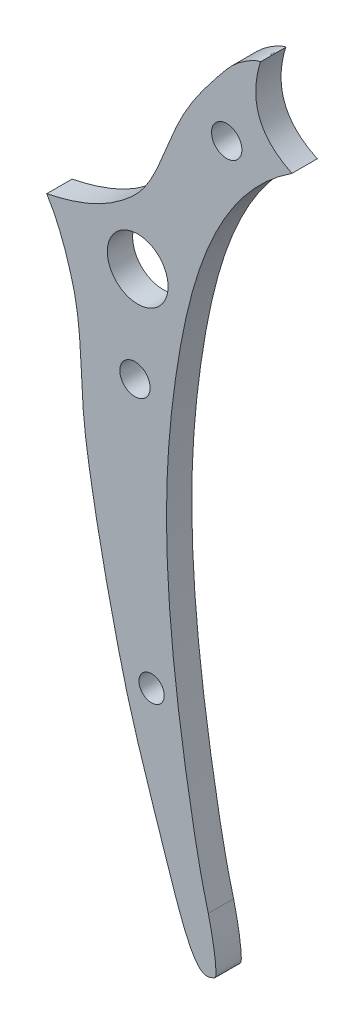
ISO-10303-21;
HEADER;
FILE_DESCRIPTION(('STEP AP214'),'2;1');
FILE_NAME('part.step','',(''),(''),'','','');
FILE_SCHEMA(('AUTOMOTIVE_DESIGN { 1 0 10303 214 1 1 1 1 }'));
ENDSEC;
DATA;
#1=APPLICATION_CONTEXT('core data for automotive mechanical design processes');
#2=APPLICATION_PROTOCOL_DEFINITION('international standard','automotive_design',2000,#1);
#3=PRODUCT_CONTEXT('',#1,'mechanical');
#4=PRODUCT('Part','Part','',(#3));
#5=PRODUCT_RELATED_PRODUCT_CATEGORY('part','',(#4));
#6=PRODUCT_DEFINITION_FORMATION('','',#4);
#7=PRODUCT_DEFINITION_CONTEXT('part definition',#1,'design');
#8=PRODUCT_DEFINITION('design','',#6,#7);
#9=PRODUCT_DEFINITION_SHAPE('','',#8);
#10=(LENGTH_UNIT() NAMED_UNIT(*) SI_UNIT(.MILLI.,.METRE.));
#11=(NAMED_UNIT(*) PLANE_ANGLE_UNIT() SI_UNIT($,.RADIAN.));
#12=(NAMED_UNIT(*) SI_UNIT($,.STERADIAN.) SOLID_ANGLE_UNIT());
#13=UNCERTAINTY_MEASURE_WITH_UNIT(LENGTH_MEASURE(1.E-05),#10,'distance_accuracy_value','');
#14=(GEOMETRIC_REPRESENTATION_CONTEXT(3) GLOBAL_UNCERTAINTY_ASSIGNED_CONTEXT((#13)) GLOBAL_UNIT_ASSIGNED_CONTEXT((#10,
#11,#12)) REPRESENTATION_CONTEXT('',''));
#15=CARTESIAN_POINT('',(0.,0.,0.));
#16=DIRECTION('',(0.,0.,1.));
#17=DIRECTION('',(1.,0.,0.));
#18=AXIS2_PLACEMENT_3D('',#15,#16,#17);
#19=CARTESIAN_POINT('',(-87.1861843515802,115.027901143904,25.));
#20=CARTESIAN_POINT('',(-76.5425272644531,98.2816896170803,25.));
#21=CARTESIAN_POINT('',(-67.4878712596053,73.4004376049712,25.));
#22=CARTESIAN_POINT('',(-52.0889897225085,17.039725060242,25.));
#23=CARTESIAN_POINT('',(-54.2193546727566,-35.9923177249694,25.));
#24=CARTESIAN_POINT('',(-41.4171310062278,-126.676087435173,25.));
#25=CARTESIAN_POINT('',(-11.075617495965,-267.508782170406,25.));
#26=CARTESIAN_POINT('',(3.32002903485526,-312.5761864347,25.));
#27=CARTESIAN_POINT('',(60.0248739983986,-482.338487703926,25.));
#28=CARTESIAN_POINT('',(72.1571609309396,-475.401329807566,25.));
#29=CARTESIAN_POINT('',(81.9097550722447,-471.892242374189,25.));
#30=CARTESIAN_POINT('',(77.4792085720168,-441.488096787512,25.));
#31=CARTESIAN_POINT('',(72.4497728717402,-420.811527797486,25.));
#32=B_SPLINE_CURVE_WITH_KNOTS('',3,(#19,#20,#21,#22,#23,#24,#25,#26,#27,#28,#29,#30,#31),
.UNSPECIFIED.,.F.,.F.,(4,1,1,1,1,1,1,1,1,1,4),(0.,0.0799305481367634,0.106477312801998,
0.247802054002309,0.285951548073293,0.470306660861802,0.743153279634555,0.791096182257853,
0.932109075446237,0.954762118385306,1.),.UNSPECIFIED.);
#33=DIRECTION('',(0.,0.,-1.));
#34=VECTOR('',#33,1.);
#35=SURFACE_OF_LINEAR_EXTRUSION('',#32,#34);
#36=CARTESIAN_POINT('',(-87.1861843515802,115.027901143904,0.));
#37=CARTESIAN_POINT('',(-76.5425272644531,98.2816896170803,0.));
#38=CARTESIAN_POINT('',(-67.4878712596053,73.4004376049712,0.));
#39=CARTESIAN_POINT('',(-52.0889897225085,17.039725060242,0.));
#40=CARTESIAN_POINT('',(-54.2193546727566,-35.9923177249694,0.));
#41=CARTESIAN_POINT('',(-41.4171310062278,-126.676087435173,0.));
#42=CARTESIAN_POINT('',(-11.075617495965,-267.508782170406,0.));
#43=CARTESIAN_POINT('',(3.32002903485526,-312.5761864347,0.));
#44=CARTESIAN_POINT('',(60.0248739983986,-482.338487703926,0.));
#45=CARTESIAN_POINT('',(72.1571609309396,-475.401329807566,0.));
#46=CARTESIAN_POINT('',(81.9097550722447,-471.892242374189,0.));
#47=CARTESIAN_POINT('',(77.4792085720168,-441.488096787512,0.));
#48=CARTESIAN_POINT('',(72.4497728717402,-420.811527797486,0.));
#49=B_SPLINE_CURVE_WITH_KNOTS('',3,(#36,#37,#38,#39,#40,#41,#42,#43,#44,#45,#46,#47,#48),
.UNSPECIFIED.,.F.,.F.,(4,1,1,1,1,1,1,1,1,1,4),(0.,0.0799305481367634,0.106477312801998,
0.247802054002309,0.285951548073293,0.470306660861802,0.743153279634555,0.791096182257853,
0.932109075446237,0.954762118385306,1.),.UNSPECIFIED.);
#50=CARTESIAN_POINT('',(-87.1861843515805,115.027901143904,0.));
#51=VERTEX_POINT('',#50);
#52=CARTESIAN_POINT('',(72.4497728717403,-420.811527797486,0.));
#53=VERTEX_POINT('',#52);
#54=EDGE_CURVE('E163',#51,#53,#49,.T.);
#55=ORIENTED_EDGE('',*,*,#54,.T.);
#56=DIRECTION('',(0.,0.,-1.));
#57=VECTOR('',#56,1.);
#58=CARTESIAN_POINT('',(72.4497728717403,-420.811527797486,25.));
#59=LINE('',#58,#57);
#60=CARTESIAN_POINT('',(72.4497728717403,-420.811527797486,25.));
#61=VERTEX_POINT('',#60);
#62=EDGE_CURVE('E11',#61,#53,#59,.T.);
#63=ORIENTED_EDGE('',*,*,#62,.F.);
#64=CARTESIAN_POINT('',(-87.1861843515805,115.027901143904,25.));
#65=VERTEX_POINT('',#64);
#66=EDGE_CURVE('E91',#65,#61,#32,.T.);
#67=ORIENTED_EDGE('',*,*,#66,.F.);
#68=DIRECTION('',(0.,0.,-1.));
#69=VECTOR('',#68,1.);
#70=CARTESIAN_POINT('',(-87.1861843515805,115.027901143904,25.));
#71=LINE('',#70,#69);
#72=EDGE_CURVE('E162',#65,#51,#71,.T.);
#73=ORIENTED_EDGE('',*,*,#72,.T.);
#74=EDGE_LOOP('',(#55,#63,#67,#73));
#75=FACE_BOUND('',#74,.T.);
#76=ADVANCED_FACE('F47',(#75),#35,.F.);
#77=CARTESIAN_POINT('',(155.117180067871,253.566910875198,25.));
#78=CARTESIAN_POINT('',(80.9612886685316,205.050155561332,25.));
#79=CARTESIAN_POINT('',(44.4458758712285,80.1171696910479,25.));
#80=CARTESIAN_POINT('',(23.7401890727471,-128.723756165747,25.));
#81=CARTESIAN_POINT('',(44.7011588682529,-287.641647918392,25.));
#82=CARTESIAN_POINT('',(65.3097013325224,-394.10237129893,25.));
#83=CARTESIAN_POINT('',(72.4497728717403,-420.811527797486,25.));
#84=B_SPLINE_CURVE_WITH_KNOTS('',3,(#77,#78,#79,#80,#81,#82,#83),.UNSPECIFIED.,.F.,.F.,(4,1,1,1,
4),(0.,0.356858306110987,0.509383165279524,0.894986658962069,1.),.UNSPECIFIED.);
#85=DIRECTION('',(0.,0.,-1.));
#86=VECTOR('',#85,1.);
#87=SURFACE_OF_LINEAR_EXTRUSION('',#84,#86);
#88=CARTESIAN_POINT('',(155.117180067871,253.566910875198,0.));
#89=CARTESIAN_POINT('',(80.9612886685316,205.050155561332,0.));
#90=CARTESIAN_POINT('',(44.4458758712285,80.1171696910479,0.));
#91=CARTESIAN_POINT('',(23.7401890727471,-128.723756165747,0.));
#92=CARTESIAN_POINT('',(44.7011588682529,-287.641647918392,0.));
#93=CARTESIAN_POINT('',(65.3097013325224,-394.10237129893,0.));
#94=CARTESIAN_POINT('',(72.4497728717403,-420.811527797486,0.));
#95=B_SPLINE_CURVE_WITH_KNOTS('',3,(#88,#89,#90,#91,#92,#93,#94),.UNSPECIFIED.,.F.,.F.,(4,1,1,1,
4),(0.,0.356858306110987,0.509383165279524,0.894986658962069,1.),.UNSPECIFIED.);
#96=CARTESIAN_POINT('',(155.117180067871,253.566910875198,0.));
#97=VERTEX_POINT('',#96);
#98=EDGE_CURVE('E101',#97,#53,#95,.T.);
#99=ORIENTED_EDGE('',*,*,#98,.F.);
#100=DIRECTION('',(0.,0.,-1.));
#101=VECTOR('',#100,1.);
#102=CARTESIAN_POINT('',(155.117180067871,253.566910875198,25.));
#103=LINE('',#102,#101);
#104=CARTESIAN_POINT('',(155.117180067871,253.566910875198,25.));
#105=VERTEX_POINT('',#104);
#106=EDGE_CURVE('E57',#105,#97,#103,.T.);
#107=ORIENTED_EDGE('',*,*,#106,.F.);
#108=EDGE_CURVE('E99',#105,#61,#84,.T.);
#109=ORIENTED_EDGE('',*,*,#108,.T.);
#110=ORIENTED_EDGE('',*,*,#62,.T.);
#111=EDGE_LOOP('',(#99,#107,#109,#110));
#112=FACE_BOUND('',#111,.T.);
#113=ADVANCED_FACE('F98',(#112),#87,.T.);
#114=CARTESIAN_POINT('',(155.117180067871,253.566910875198,25.));
#115=CARTESIAN_POINT('',(106.393272385494,276.590125095207,25.));
#116=CARTESIAN_POINT('',(123.991455877653,333.411826796243,25.));
#117=B_SPLINE_CURVE_WITH_KNOTS('',2,(#114,#115,#116),.UNSPECIFIED.,.F.,.F.,(3,3),(0.,1.),.UNSPECIFIED.);
#118=DIRECTION('',(0.,0.,-1.));
#119=VECTOR('',#118,1.);
#120=SURFACE_OF_LINEAR_EXTRUSION('',#117,#119);
#121=CARTESIAN_POINT('',(155.117180067871,253.566910875198,0.));
#122=CARTESIAN_POINT('',(106.393272385494,276.590125095207,0.));
#123=CARTESIAN_POINT('',(123.991455877653,333.411826796243,0.));
#124=B_SPLINE_CURVE_WITH_KNOTS('',2,(#121,#122,#123),.UNSPECIFIED.,.F.,.F.,(3,3),(0.,1.),.UNSPECIFIED.);
#125=CARTESIAN_POINT('',(123.991455877653,333.411826796243,0.));
#126=VERTEX_POINT('',#125);
#127=EDGE_CURVE('E80',#97,#126,#124,.T.);
#128=ORIENTED_EDGE('',*,*,#127,.T.);
#129=DIRECTION('',(0.,0.,-1.));
#130=VECTOR('',#129,1.);
#131=CARTESIAN_POINT('',(123.991455877653,333.411826796243,25.));
#132=LINE('',#131,#130);
#133=CARTESIAN_POINT('',(123.991455877653,333.411826796243,25.));
#134=VERTEX_POINT('',#133);
#135=EDGE_CURVE('E103',#134,#126,#132,.T.);
#136=ORIENTED_EDGE('',*,*,#135,.F.);
#137=EDGE_CURVE('E104',#105,#134,#117,.T.);
#138=ORIENTED_EDGE('',*,*,#137,.F.);
#139=ORIENTED_EDGE('',*,*,#106,.T.);
#140=EDGE_LOOP('',(#128,#136,#138,#139));
#141=FACE_BOUND('',#140,.T.);
#142=ADVANCED_FACE('F105',(#141),#120,.F.);
#143=CARTESIAN_POINT('',(2.70839091096043,95.5203556953334,25.));
#144=DIRECTION('',(0.,0.,-1.));
#145=DIRECTION('',(-1.,0.,0.));
#146=AXIS2_PLACEMENT_3D('',#143,#144,#145);
#147=CYLINDRICAL_SURFACE('',#146,30.);
#148=CARTESIAN_POINT('',(2.70839091096043,95.5203556953334,25.));
#149=DIRECTION('',(0.,0.,1.));
#150=DIRECTION('',(1.,0.,0.));
#151=AXIS2_PLACEMENT_3D('',#148,#149,#150);
#152=CIRCLE('',#151,30.);
#153=CARTESIAN_POINT('',(32.7083909109604,95.5203556953334,25.));
#154=VERTEX_POINT('',#153);
#155=EDGE_CURVE('E154',#154,#154,#152,.T.);
#156=ORIENTED_EDGE('',*,*,#155,.T.);
#157=EDGE_LOOP('',(#156));
#158=FACE_BOUND('',#157,.T.);
#159=CARTESIAN_POINT('',(2.70839091096043,95.5203556953334,0.));
#160=DIRECTION('',(0.,0.,1.));
#161=DIRECTION('',(1.,0.,0.));
#162=AXIS2_PLACEMENT_3D('',#159,#160,#161);
#163=CIRCLE('',#162,30.);
#164=CARTESIAN_POINT('',(32.7083909109604,95.5203556953334,0.));
#165=VERTEX_POINT('',#164);
#166=EDGE_CURVE('E201',#165,#165,#163,.T.);
#167=ORIENTED_EDGE('',*,*,#166,.F.);
#168=EDGE_LOOP('',(#167));
#169=FACE_BOUND('',#168,.T.);
#170=ADVANCED_FACE('F131',(#158,#169),#147,.F.);
#171=CARTESIAN_POINT('',(90.6353379813006,249.018544508266,25.));
#172=DIRECTION('',(0.,0.,-1.));
#173=DIRECTION('',(-1.,0.,0.));
#174=AXIS2_PLACEMENT_3D('',#171,#172,#173);
#175=CYLINDRICAL_SURFACE('',#174,15.);
#176=CARTESIAN_POINT('',(90.6353379813006,249.018544508266,25.));
#177=DIRECTION('',(0.,0.,1.));
#178=DIRECTION('',(1.,0.,0.));
#179=AXIS2_PLACEMENT_3D('',#176,#177,#178);
#180=CIRCLE('',#179,15.);
#181=CARTESIAN_POINT('',(105.635337981301,249.018544508266,25.));
#182=VERTEX_POINT('',#181);
#183=EDGE_CURVE('E150',#182,#182,#180,.T.);
#184=ORIENTED_EDGE('',*,*,#183,.T.);
#185=EDGE_LOOP('',(#184));
#186=FACE_BOUND('',#185,.T.);
#187=CARTESIAN_POINT('',(90.6353379813006,249.018544508266,0.));
#188=DIRECTION('',(0.,0.,1.));
#189=DIRECTION('',(1.,0.,0.));
#190=AXIS2_PLACEMENT_3D('',#187,#188,#189);
#191=CIRCLE('',#190,15.);
#192=CARTESIAN_POINT('',(105.635337981301,249.018544508266,0.));
#193=VERTEX_POINT('',#192);
#194=EDGE_CURVE('E197',#193,#193,#191,.T.);
#195=ORIENTED_EDGE('',*,*,#194,.F.);
#196=EDGE_LOOP('',(#195));
#197=FACE_BOUND('',#196,.T.);
#198=ADVANCED_FACE('F236',(#186,#197),#175,.F.);
#199=CARTESIAN_POINT('',(16.4286998587459,-256.271030273807,25.));
#200=DIRECTION('',(0.,0.,-1.));
#201=DIRECTION('',(-1.,0.,0.));
#202=AXIS2_PLACEMENT_3D('',#199,#200,#201);
#203=CYLINDRICAL_SURFACE('',#202,12.5);
#204=CARTESIAN_POINT('',(16.4286998587459,-256.271030273807,25.));
#205=DIRECTION('',(0.,0.,1.));
#206=DIRECTION('',(1.,0.,0.));
#207=AXIS2_PLACEMENT_3D('',#204,#205,#206);
#208=CIRCLE('',#207,12.5);
#209=CARTESIAN_POINT('',(28.9286998587459,-256.271030273807,25.));
#210=VERTEX_POINT('',#209);
#211=EDGE_CURVE('E143',#210,#210,#208,.T.);
#212=ORIENTED_EDGE('',*,*,#211,.T.);
#213=EDGE_LOOP('',(#212));
#214=FACE_BOUND('',#213,.T.);
#215=CARTESIAN_POINT('',(16.4286998587459,-256.271030273807,0.));
#216=DIRECTION('',(0.,0.,1.));
#217=DIRECTION('',(1.,0.,0.));
#218=AXIS2_PLACEMENT_3D('',#215,#216,#217);
#219=CIRCLE('',#218,12.5);
#220=CARTESIAN_POINT('',(28.9286998587459,-256.271030273807,0.));
#221=VERTEX_POINT('',#220);
#222=EDGE_CURVE('E190',#221,#221,#219,.T.);
#223=ORIENTED_EDGE('',*,*,#222,.F.);
#224=EDGE_LOOP('',(#223));
#225=FACE_BOUND('',#224,.T.);
#226=ADVANCED_FACE('F136',(#214,#225),#203,.F.);
#227=CARTESIAN_POINT('',(123.991455877653,333.411826796243,25.));
#228=CARTESIAN_POINT('',(121.940962732917,333.924631611575,25.));
#229=CARTESIAN_POINT('',(103.126737259353,325.594457240455,25.));
#230=CARTESIAN_POINT('',(76.8434099424331,293.735407356811,25.));
#231=CARTESIAN_POINT('',(36.561568956429,242.824472462812,25.));
#232=CARTESIAN_POINT('',(21.3704410548067,176.135728768921,25.));
#233=CARTESIAN_POINT('',(-25.7972450538794,134.360058233217,25.));
#234=CARTESIAN_POINT('',(-52.7841078448604,122.398568008737,25.));
#235=CARTESIAN_POINT('',(-87.1861843515805,115.027901143904,25.));
#236=B_SPLINE_CURVE_WITH_KNOTS('',3,(#227,#228,#229,#230,#231,#232,#233,#234,#235),
.UNSPECIFIED.,.F.,.F.,(4,1,1,1,1,1,4),(0.,0.175010548646843,0.215542487207237,0.40531938560394,
0.676608920644849,0.736076982084455,1.),.UNSPECIFIED.);
#237=DIRECTION('',(0.,0.,-1.));
#238=VECTOR('',#237,1.);
#239=SURFACE_OF_LINEAR_EXTRUSION('',#236,#238);
#240=CARTESIAN_POINT('',(123.991455877653,333.411826796243,0.));
#241=CARTESIAN_POINT('',(121.940962732917,333.924631611575,0.));
#242=CARTESIAN_POINT('',(103.126737259353,325.594457240455,0.));
#243=CARTESIAN_POINT('',(76.8434099424331,293.735407356811,0.));
#244=CARTESIAN_POINT('',(36.561568956429,242.824472462812,0.));
#245=CARTESIAN_POINT('',(21.3704410548067,176.135728768921,0.));
#246=CARTESIAN_POINT('',(-25.7972450538794,134.360058233217,0.));
#247=CARTESIAN_POINT('',(-52.7841078448604,122.398568008737,0.));
#248=CARTESIAN_POINT('',(-87.1861843515805,115.027901143904,0.));
#249=B_SPLINE_CURVE_WITH_KNOTS('',3,(#240,#241,#242,#243,#244,#245,#246,#247,#248),
.UNSPECIFIED.,.F.,.F.,(4,1,1,1,1,1,4),(0.,0.175010548646843,0.215542487207237,0.40531938560394,
0.676608920644849,0.736076982084455,1.),.UNSPECIFIED.);
#250=EDGE_CURVE('E86',#126,#51,#249,.T.);
#251=ORIENTED_EDGE('',*,*,#250,.T.);
#252=ORIENTED_EDGE('',*,*,#72,.F.);
#253=EDGE_CURVE('E65',#134,#65,#236,.T.);
#254=ORIENTED_EDGE('',*,*,#253,.F.);
#255=ORIENTED_EDGE('',*,*,#135,.T.);
#256=EDGE_LOOP('',(#251,#252,#254,#255));
#257=FACE_BOUND('',#256,.T.);
#258=ADVANCED_FACE('F132',(#257),#239,.F.);
#259=CARTESIAN_POINT('',(0.,0.,25.));
#260=DIRECTION('',(0.,0.,-1.));
#261=DIRECTION('',(-1.,0.,0.));
#262=AXIS2_PLACEMENT_3D('',#259,#260,#261);
#263=CYLINDRICAL_SURFACE('',#262,15.);
#264=CARTESIAN_POINT('',(0.,0.,25.));
#265=DIRECTION('',(0.,0.,1.));
#266=DIRECTION('',(1.,0.,0.));
#267=AXIS2_PLACEMENT_3D('',#264,#265,#266);
#268=CIRCLE('',#267,15.);
#269=CARTESIAN_POINT('',(15.,0.,25.));
#270=VERTEX_POINT('',#269);
#271=EDGE_CURVE('E158',#270,#270,#268,.T.);
#272=ORIENTED_EDGE('',*,*,#271,.T.);
#273=EDGE_LOOP('',(#272));
#274=FACE_BOUND('',#273,.T.);
#275=CARTESIAN_POINT('',(0.,0.,0.));
#276=DIRECTION('',(0.,0.,1.));
#277=DIRECTION('',(1.,0.,0.));
#278=AXIS2_PLACEMENT_3D('',#275,#276,#277);
#279=CIRCLE('',#278,15.);
#280=CARTESIAN_POINT('',(15.,0.,0.));
#281=VERTEX_POINT('',#280);
#282=EDGE_CURVE('E113',#281,#281,#279,.T.);
#283=ORIENTED_EDGE('',*,*,#282,.F.);
#284=EDGE_LOOP('',(#283));
#285=FACE_BOUND('',#284,.T.);
#286=ADVANCED_FACE('F135',(#274,#285),#263,.F.);
#287=CARTESIAN_POINT('',(0.,0.,25.));
#288=DIRECTION('',(0.,0.,1.));
#289=DIRECTION('',(1.,0.,0.));
#290=AXIS2_PLACEMENT_3D('',#287,#288,#289);
#291=PLANE('',#290);
#292=ORIENTED_EDGE('',*,*,#66,.T.);
#293=ORIENTED_EDGE('',*,*,#108,.F.);
#294=ORIENTED_EDGE('',*,*,#137,.T.);
#295=ORIENTED_EDGE('',*,*,#253,.T.);
#296=EDGE_LOOP('',(#292,#293,#294,#295));
#297=FACE_BOUND('',#296,.T.);
#298=ORIENTED_EDGE('',*,*,#211,.F.);
#299=EDGE_LOOP('',(#298));
#300=FACE_BOUND('',#299,.T.);
#301=ORIENTED_EDGE('',*,*,#183,.F.);
#302=EDGE_LOOP('',(#301));
#303=FACE_BOUND('',#302,.T.);
#304=ORIENTED_EDGE('',*,*,#155,.F.);
#305=EDGE_LOOP('',(#304));
#306=FACE_BOUND('',#305,.T.);
#307=ORIENTED_EDGE('',*,*,#271,.F.);
#308=EDGE_LOOP('',(#307));
#309=FACE_BOUND('',#308,.T.);
#310=ADVANCED_FACE('F108',(#297,#300,#303,#306,#309),#291,.T.);
#311=CARTESIAN_POINT('',(0.,0.,0.));
#312=DIRECTION('',(0.,0.,1.));
#313=DIRECTION('',(1.,0.,0.));
#314=AXIS2_PLACEMENT_3D('',#311,#312,#313);
#315=PLANE('',#314);
#316=ORIENTED_EDGE('',*,*,#54,.F.);
#317=ORIENTED_EDGE('',*,*,#250,.F.);
#318=ORIENTED_EDGE('',*,*,#127,.F.);
#319=ORIENTED_EDGE('',*,*,#98,.T.);
#320=EDGE_LOOP('',(#316,#317,#318,#319));
#321=FACE_BOUND('',#320,.T.);
#322=ORIENTED_EDGE('',*,*,#222,.T.);
#323=EDGE_LOOP('',(#322));
#324=FACE_BOUND('',#323,.T.);
#325=ORIENTED_EDGE('',*,*,#194,.T.);
#326=EDGE_LOOP('',(#325));
#327=FACE_BOUND('',#326,.T.);
#328=ORIENTED_EDGE('',*,*,#166,.T.);
#329=EDGE_LOOP('',(#328));
#330=FACE_BOUND('',#329,.T.);
#331=ORIENTED_EDGE('',*,*,#282,.T.);
#332=EDGE_LOOP('',(#331));
#333=FACE_BOUND('',#332,.T.);
#334=ADVANCED_FACE('F213',(#321,#324,#327,#330,#333),#315,.F.);
#335=CLOSED_SHELL('',(#76,#113,#142,#170,#198,#226,#258,#286,#310,#334));
#336=MANIFOLD_SOLID_BREP('B2',#335);
#337=ADVANCED_BREP_SHAPE_REPRESENTATION('',(#18,#336),#14);
#338=SHAPE_DEFINITION_REPRESENTATION(#9,#337);
ENDSEC;
END-ISO-10303-21;
